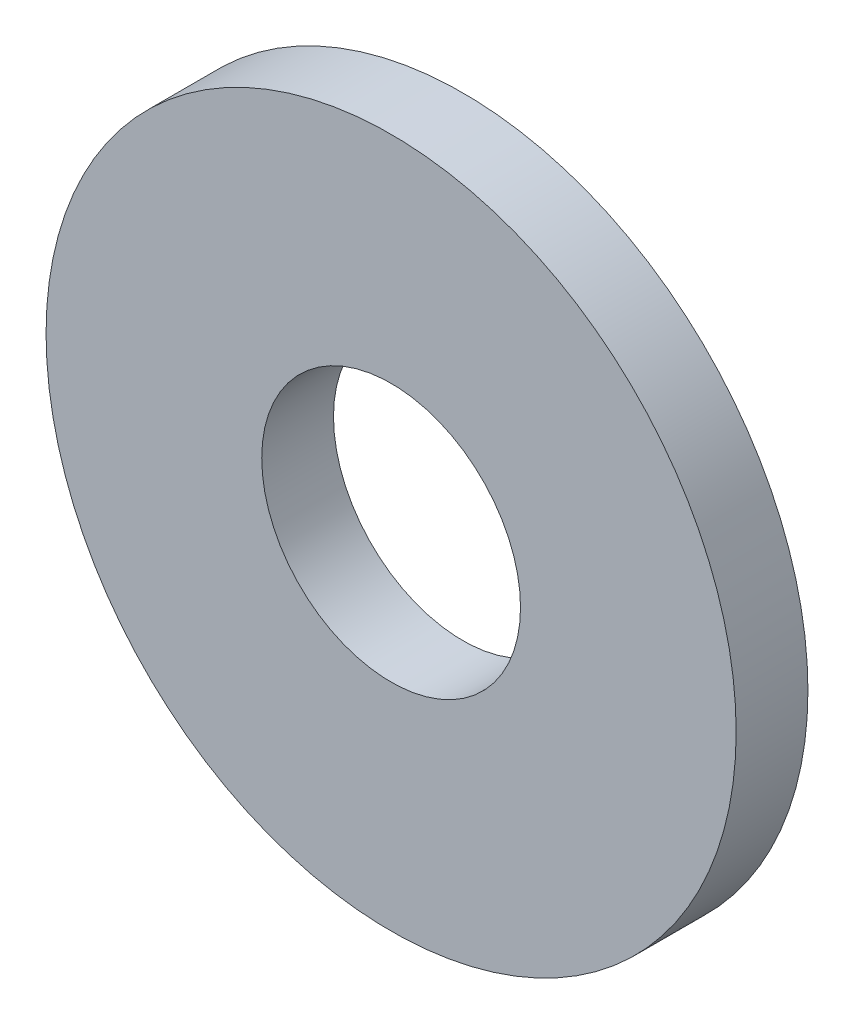
ISO-10303-21;
HEADER;
FILE_DESCRIPTION(('STEP AP214'),'2;1');
FILE_NAME('part.step','',(''),(''),'','','');
FILE_SCHEMA(('AUTOMOTIVE_DESIGN { 1 0 10303 214 1 1 1 1 }'));
ENDSEC;
DATA;
#1=APPLICATION_CONTEXT('core data for automotive mechanical design processes');
#2=APPLICATION_PROTOCOL_DEFINITION('international standard','automotive_design',2000,#1);
#3=PRODUCT_CONTEXT('',#1,'mechanical');
#4=PRODUCT('Part','Part','',(#3));
#5=PRODUCT_RELATED_PRODUCT_CATEGORY('part','',(#4));
#6=PRODUCT_DEFINITION_FORMATION('','',#4);
#7=PRODUCT_DEFINITION_CONTEXT('part definition',#1,'design');
#8=PRODUCT_DEFINITION('design','',#6,#7);
#9=PRODUCT_DEFINITION_SHAPE('','',#8);
#10=(LENGTH_UNIT() NAMED_UNIT(*) SI_UNIT(.MILLI.,.METRE.));
#11=(NAMED_UNIT(*) PLANE_ANGLE_UNIT() SI_UNIT($,.RADIAN.));
#12=(NAMED_UNIT(*) SI_UNIT($,.STERADIAN.) SOLID_ANGLE_UNIT());
#13=UNCERTAINTY_MEASURE_WITH_UNIT(LENGTH_MEASURE(1.E-05),#10,'distance_accuracy_value','');
#14=(GEOMETRIC_REPRESENTATION_CONTEXT(3) GLOBAL_UNCERTAINTY_ASSIGNED_CONTEXT((#13)) GLOBAL_UNIT_ASSIGNED_CONTEXT((#10,
#11,#12)) REPRESENTATION_CONTEXT('',''));
#15=CARTESIAN_POINT('',(0.,0.,0.));
#16=DIRECTION('',(0.,0.,1.));
#17=DIRECTION('',(1.,0.,0.));
#18=AXIS2_PLACEMENT_3D('',#15,#16,#17);
#19=CARTESIAN_POINT('',(0.,1.38777878078145E-13,1.32080000000009));
#20=DIRECTION('',(0.,0.,1.00000000000001));
#21=DIRECTION('',(1.,0.,0.));
#22=AXIS2_PLACEMENT_3D('',#19,#20,#21);
#23=PLANE('',#22);
#24=CARTESIAN_POINT('',(0.,1.38777878078145E-13,1.32080000000009));
#25=DIRECTION('',(0.,0.,1.00000000000001));
#26=DIRECTION('',(1.,0.,0.));
#27=AXIS2_PLACEMENT_3D('',#24,#25,#26);
#28=CIRCLE('',#27,12.7);
#29=CARTESIAN_POINT('',(12.7,1.38777878078144E-13,1.32080000000009));
#30=VERTEX_POINT('',#29);
#31=EDGE_CURVE('E12',#30,#30,#28,.T.);
#32=ORIENTED_EDGE('',*,*,#31,.T.);
#33=EDGE_LOOP('',(#32));
#34=FACE_BOUND('',#33,.T.);
#35=CARTESIAN_POINT('',(0.,1.38777878078145E-13,1.32080000000009));
#36=DIRECTION('',(0.,0.,1.00000000000001));
#37=DIRECTION('',(1.,0.,0.));
#38=AXIS2_PLACEMENT_3D('',#35,#36,#37);
#39=CIRCLE('',#38,4.7625);
#40=CARTESIAN_POINT('',(4.7625,1.38777878078144E-13,1.32080000000009));
#41=VERTEX_POINT('',#40);
#42=EDGE_CURVE('E51',#41,#41,#39,.T.);
#43=ORIENTED_EDGE('',*,*,#42,.F.);
#44=EDGE_LOOP('',(#43));
#45=FACE_BOUND('',#44,.T.);
#46=ADVANCED_FACE('F40',(#34,#45),#23,.T.);
#47=CARTESIAN_POINT('',(1.12757025938492E-13,0.,-1.32080000000001));
#48=DIRECTION('',(0.,0.,1.00000000000001));
#49=DIRECTION('',(1.,0.,0.));
#50=AXIS2_PLACEMENT_3D('',#47,#48,#49);
#51=PLANE('',#50);
#52=CARTESIAN_POINT('',(1.12757025938492E-13,0.,-1.32080000000001));
#53=DIRECTION('',(0.,0.,1.00000000000001));
#54=DIRECTION('',(1.,0.,0.));
#55=AXIS2_PLACEMENT_3D('',#52,#53,#54);
#56=CIRCLE('',#55,12.7);
#57=CARTESIAN_POINT('',(12.7000000000001,0.,-1.32080000000001));
#58=VERTEX_POINT('',#57);
#59=EDGE_CURVE('E44',#58,#58,#56,.T.);
#60=ORIENTED_EDGE('',*,*,#59,.F.);
#61=EDGE_LOOP('',(#60));
#62=FACE_BOUND('',#61,.T.);
#63=CARTESIAN_POINT('',(1.12757025938492E-13,0.,-1.32080000000001));
#64=DIRECTION('',(0.,0.,1.00000000000001));
#65=DIRECTION('',(1.,0.,0.));
#66=AXIS2_PLACEMENT_3D('',#63,#64,#65);
#67=CIRCLE('',#66,4.7625);
#68=CARTESIAN_POINT('',(4.76250000000011,0.,-1.32080000000001));
#69=VERTEX_POINT('',#68);
#70=EDGE_CURVE('E53',#69,#69,#67,.T.);
#71=ORIENTED_EDGE('',*,*,#70,.T.);
#72=EDGE_LOOP('',(#71));
#73=FACE_BOUND('',#72,.T.);
#74=ADVANCED_FACE('F63',(#62,#73),#51,.F.);
#75=CARTESIAN_POINT('',(0.,1.38777878078145E-13,1.32080000000009));
#76=DIRECTION('',(0.,0.,-1.00000000000001));
#77=DIRECTION('',(-1.,0.,0.));
#78=AXIS2_PLACEMENT_3D('',#75,#76,#77);
#79=CYLINDRICAL_SURFACE('',#78,12.7);
#80=ORIENTED_EDGE('',*,*,#31,.F.);
#81=EDGE_LOOP('',(#80));
#82=FACE_BOUND('',#81,.T.);
#83=ORIENTED_EDGE('',*,*,#59,.T.);
#84=EDGE_LOOP('',(#83));
#85=FACE_BOUND('',#84,.T.);
#86=ADVANCED_FACE('F42',(#82,#85),#79,.T.);
#87=CARTESIAN_POINT('',(0.,1.38777878078145E-13,1.32080000000009));
#88=DIRECTION('',(0.,0.,-1.00000000000001));
#89=DIRECTION('',(-1.,0.,0.));
#90=AXIS2_PLACEMENT_3D('',#87,#88,#89);
#91=CYLINDRICAL_SURFACE('',#90,4.7625);
#92=ORIENTED_EDGE('',*,*,#42,.T.);
#93=EDGE_LOOP('',(#92));
#94=FACE_BOUND('',#93,.T.);
#95=ORIENTED_EDGE('',*,*,#70,.F.);
#96=EDGE_LOOP('',(#95));
#97=FACE_BOUND('',#96,.T.);
#98=ADVANCED_FACE('F59',(#94,#97),#91,.F.);
#99=CLOSED_SHELL('',(#46,#74,#86,#98));
#100=MANIFOLD_SOLID_BREP('B2',#99);
#101=ADVANCED_BREP_SHAPE_REPRESENTATION('',(#18,#100),#14);
#102=SHAPE_DEFINITION_REPRESENTATION(#9,#101);
ENDSEC;
END-ISO-10303-21;
